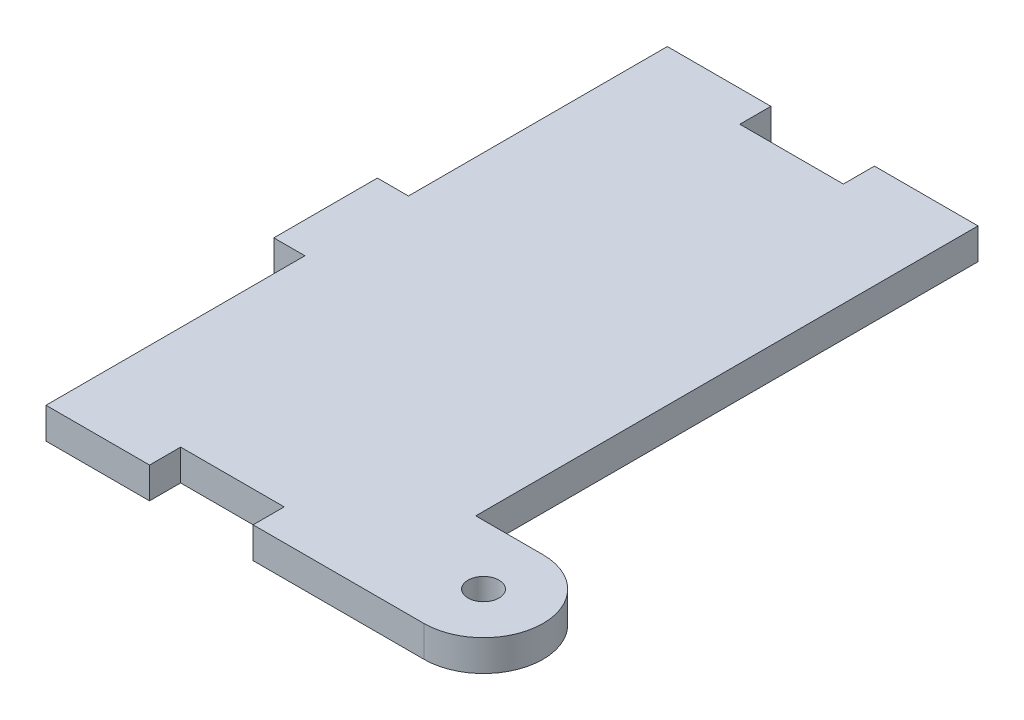
ISO-10303-21;
HEADER;
FILE_DESCRIPTION(('STEP AP214'),'2;1');
FILE_NAME('part.step','',(''),(''),'','','');
FILE_SCHEMA(('AUTOMOTIVE_DESIGN { 1 0 10303 214 1 1 1 1 }'));
ENDSEC;
DATA;
#1=APPLICATION_CONTEXT('core data for automotive mechanical design processes');
#2=APPLICATION_PROTOCOL_DEFINITION('international standard','automotive_design',2000,#1);
#3=PRODUCT_CONTEXT('',#1,'mechanical');
#4=PRODUCT('Part','Part','',(#3));
#5=PRODUCT_RELATED_PRODUCT_CATEGORY('part','',(#4));
#6=PRODUCT_DEFINITION_FORMATION('','',#4);
#7=PRODUCT_DEFINITION_CONTEXT('part definition',#1,'design');
#8=PRODUCT_DEFINITION('design','',#6,#7);
#9=PRODUCT_DEFINITION_SHAPE('','',#8);
#10=(LENGTH_UNIT() NAMED_UNIT(*) SI_UNIT(.MILLI.,.METRE.));
#11=(NAMED_UNIT(*) PLANE_ANGLE_UNIT() SI_UNIT($,.RADIAN.));
#12=(NAMED_UNIT(*) SI_UNIT($,.STERADIAN.) SOLID_ANGLE_UNIT());
#13=UNCERTAINTY_MEASURE_WITH_UNIT(LENGTH_MEASURE(1.E-05),#10,'distance_accuracy_value','');
#14=(GEOMETRIC_REPRESENTATION_CONTEXT(3) GLOBAL_UNCERTAINTY_ASSIGNED_CONTEXT((#13)) GLOBAL_UNIT_ASSIGNED_CONTEXT((#10,
#11,#12)) REPRESENTATION_CONTEXT('',''));
#15=CARTESIAN_POINT('',(0.,0.,0.));
#16=DIRECTION('',(0.,0.,1.));
#17=DIRECTION('',(1.,0.,0.));
#18=AXIS2_PLACEMENT_3D('',#15,#16,#17);
#19=CARTESIAN_POINT('',(21.5,3.,24.2499999999999));
#20=DIRECTION('',(0.,1.,0.));
#21=DIRECTION('',(0.,0.,1.));
#22=AXIS2_PLACEMENT_3D('',#19,#20,#21);
#23=PLANE('',#22);
#24=DIRECTION('',(1.,0.,0.));
#25=VECTOR('',#24,1.);
#26=CARTESIAN_POINT('',(-5.00000000000001,3.,29.9999999999999));
#27=LINE('',#26,#25);
#28=CARTESIAN_POINT('',(-15.,3.,29.9999999999999));
#29=VERTEX_POINT('',#28);
#30=CARTESIAN_POINT('',(-5.00000000000001,3.,29.9999999999999));
#31=VERTEX_POINT('',#30);
#32=EDGE_CURVE('E227',#29,#31,#27,.T.);
#33=ORIENTED_EDGE('',*,*,#32,.T.);
#34=DIRECTION('',(0.,0.,-1.));
#35=VECTOR('',#34,1.);
#36=CARTESIAN_POINT('',(-5.00000000000001,3.,29.9999999999999));
#37=LINE('',#36,#35);
#38=CARTESIAN_POINT('',(-5.00000000000001,3.,26.9999999999999));
#39=VERTEX_POINT('',#38);
#40=EDGE_CURVE('E123',#31,#39,#37,.T.);
#41=ORIENTED_EDGE('',*,*,#40,.T.);
#42=DIRECTION('',(1.,0.,0.));
#43=VECTOR('',#42,1.);
#44=CARTESIAN_POINT('',(-5.00000000000001,3.,26.9999999999999));
#45=LINE('',#44,#43);
#46=CARTESIAN_POINT('',(4.99999999999999,3.,26.9999999999999));
#47=VERTEX_POINT('',#46);
#48=EDGE_CURVE('E272',#39,#47,#45,.T.);
#49=ORIENTED_EDGE('',*,*,#48,.T.);
#50=DIRECTION('',(0.,0.,1.));
#51=VECTOR('',#50,1.);
#52=CARTESIAN_POINT('',(4.99999999999999,3.,29.9999999999999));
#53=LINE('',#52,#51);
#54=CARTESIAN_POINT('',(4.99999999999999,3.,29.9999999999999));
#55=VERTEX_POINT('',#54);
#56=EDGE_CURVE('E290',#47,#55,#53,.T.);
#57=ORIENTED_EDGE('',*,*,#56,.T.);
#58=DIRECTION('',(1.,0.,0.));
#59=VECTOR('',#58,1.);
#60=CARTESIAN_POINT('',(15.,3.,29.9999999999999));
#61=LINE('',#60,#59);
#62=CARTESIAN_POINT('',(21.5,3.,29.9999999999999));
#63=VERTEX_POINT('',#62);
#64=EDGE_CURVE('E287',#55,#63,#61,.T.);
#65=ORIENTED_EDGE('',*,*,#64,.T.);
#66=CARTESIAN_POINT('',(21.5,3.,24.2499999999999));
#67=DIRECTION('',(0.,1.,0.));
#68=DIRECTION('',(0.,0.,1.));
#69=AXIS2_PLACEMENT_3D('',#66,#67,#68);
#70=CIRCLE('',#69,5.75);
#71=CARTESIAN_POINT('',(21.5,3.,18.4999999999999));
#72=VERTEX_POINT('',#71);
#73=EDGE_CURVE('E289',#63,#72,#70,.T.);
#74=ORIENTED_EDGE('',*,*,#73,.T.);
#75=DIRECTION('',(-1.,0.,0.));
#76=VECTOR('',#75,1.);
#77=CARTESIAN_POINT('',(21.5,3.,18.4999999999999));
#78=LINE('',#77,#76);
#79=CARTESIAN_POINT('',(15.,3.,18.4999999999999));
#80=VERTEX_POINT('',#79);
#81=EDGE_CURVE('E292',#72,#80,#78,.T.);
#82=ORIENTED_EDGE('',*,*,#81,.T.);
#83=DIRECTION('',(0.,0.,-1.));
#84=VECTOR('',#83,1.);
#85=CARTESIAN_POINT('',(15.,3.,4.99999999999995));
#86=LINE('',#85,#84);
#87=CARTESIAN_POINT('',(15.,3.,-30.0000000000001));
#88=VERTEX_POINT('',#87);
#89=EDGE_CURVE('E298',#80,#88,#86,.T.);
#90=ORIENTED_EDGE('',*,*,#89,.T.);
#91=DIRECTION('',(-1.,0.,0.));
#92=VECTOR('',#91,1.);
#93=CARTESIAN_POINT('',(15.,3.,-30.0000000000001));
#94=LINE('',#93,#92);
#95=CARTESIAN_POINT('',(4.99999999999999,3.,-30.0000000000001));
#96=VERTEX_POINT('',#95);
#97=EDGE_CURVE('E300',#88,#96,#94,.T.);
#98=ORIENTED_EDGE('',*,*,#97,.T.);
#99=DIRECTION('',(0.,0.,1.));
#100=VECTOR('',#99,1.);
#101=CARTESIAN_POINT('',(4.99999999999999,3.,-30.0000000000001));
#102=LINE('',#101,#100);
#103=CARTESIAN_POINT('',(4.99999999999999,3.,-27.0000000000001));
#104=VERTEX_POINT('',#103);
#105=EDGE_CURVE('E302',#96,#104,#102,.T.);
#106=ORIENTED_EDGE('',*,*,#105,.T.);
#107=DIRECTION('',(-1.,0.,0.));
#108=VECTOR('',#107,1.);
#109=CARTESIAN_POINT('',(-5.00000000000001,3.,-27.0000000000001));
#110=LINE('',#109,#108);
#111=CARTESIAN_POINT('',(-5.00000000000001,3.,-27.0000000000001));
#112=VERTEX_POINT('',#111);
#113=EDGE_CURVE('E304',#104,#112,#110,.T.);
#114=ORIENTED_EDGE('',*,*,#113,.T.);
#115=DIRECTION('',(0.,0.,-1.));
#116=VECTOR('',#115,1.);
#117=CARTESIAN_POINT('',(-5.00000000000001,3.,-30.0000000000001));
#118=LINE('',#117,#116);
#119=CARTESIAN_POINT('',(-5.00000000000001,3.,-30.0000000000001));
#120=VERTEX_POINT('',#119);
#121=EDGE_CURVE('E306',#112,#120,#118,.T.);
#122=ORIENTED_EDGE('',*,*,#121,.T.);
#123=DIRECTION('',(-1.,0.,0.));
#124=VECTOR('',#123,1.);
#125=CARTESIAN_POINT('',(-5.00000000000001,3.,-30.0000000000001));
#126=LINE('',#125,#124);
#127=CARTESIAN_POINT('',(-15.,3.,-30.0000000000001));
#128=VERTEX_POINT('',#127);
#129=EDGE_CURVE('E308',#120,#128,#126,.T.);
#130=ORIENTED_EDGE('',*,*,#129,.T.);
#131=DIRECTION('',(0.,0.,1.));
#132=VECTOR('',#131,1.);
#133=CARTESIAN_POINT('',(-15.,3.,-30.0000000000001));
#134=LINE('',#133,#132);
#135=CARTESIAN_POINT('',(-15.,3.,-5.00000000000005));
#136=VERTEX_POINT('',#135);
#137=EDGE_CURVE('E310',#128,#136,#134,.T.);
#138=ORIENTED_EDGE('',*,*,#137,.T.);
#139=DIRECTION('',(-1.,0.,0.));
#140=VECTOR('',#139,1.);
#141=CARTESIAN_POINT('',(-15.,3.,-5.00000000000005));
#142=LINE('',#141,#140);
#143=CARTESIAN_POINT('',(-18.,3.,-5.00000000000005));
#144=VERTEX_POINT('',#143);
#145=EDGE_CURVE('E172',#136,#144,#142,.T.);
#146=ORIENTED_EDGE('',*,*,#145,.T.);
#147=DIRECTION('',(0.,0.,1.));
#148=VECTOR('',#147,1.);
#149=CARTESIAN_POINT('',(-18.,3.,-5.00000000000005));
#150=LINE('',#149,#148);
#151=CARTESIAN_POINT('',(-18.,3.,4.99999999999995));
#152=VERTEX_POINT('',#151);
#153=EDGE_CURVE('E166',#144,#152,#150,.T.);
#154=ORIENTED_EDGE('',*,*,#153,.T.);
#155=DIRECTION('',(1.,0.,0.));
#156=VECTOR('',#155,1.);
#157=CARTESIAN_POINT('',(-15.,3.,4.99999999999995));
#158=LINE('',#157,#156);
#159=CARTESIAN_POINT('',(-15.,3.,4.99999999999995));
#160=VERTEX_POINT('',#159);
#161=EDGE_CURVE('E170',#152,#160,#158,.T.);
#162=ORIENTED_EDGE('',*,*,#161,.T.);
#163=DIRECTION('',(0.,0.,1.));
#164=VECTOR('',#163,1.);
#165=CARTESIAN_POINT('',(-15.,3.,4.99999999999995));
#166=LINE('',#165,#164);
#167=EDGE_CURVE('E50',#160,#29,#166,.T.);
#168=ORIENTED_EDGE('',*,*,#167,.T.);
#169=EDGE_LOOP('',(#33,#41,#49,#57,#65,#74,#82,#90,#98,#106,#114,#122,#130,#138,#146,#154,#162,#168));
#170=FACE_BOUND('',#169,.T.);
#171=CARTESIAN_POINT('',(21.5,3.,24.2499999999999));
#172=DIRECTION('',(0.,1.,0.));
#173=DIRECTION('',(0.,0.,1.));
#174=AXIS2_PLACEMENT_3D('',#171,#172,#173);
#175=CIRCLE('',#174,1.5);
#176=CARTESIAN_POINT('',(21.5,3.,25.7499999999999));
#177=VERTEX_POINT('',#176);
#178=EDGE_CURVE('E194',#177,#177,#175,.T.);
#179=ORIENTED_EDGE('',*,*,#178,.F.);
#180=EDGE_LOOP('',(#179));
#181=FACE_BOUND('',#180,.T.);
#182=ADVANCED_FACE('F33',(#170,#181),#23,.T.);
#183=CARTESIAN_POINT('',(21.5,0.,24.2499999999999));
#184=DIRECTION('',(0.,1.,0.));
#185=DIRECTION('',(0.,0.,1.));
#186=AXIS2_PLACEMENT_3D('',#183,#184,#185);
#187=PLANE('',#186);
#188=DIRECTION('',(1.,0.,0.));
#189=VECTOR('',#188,1.);
#190=CARTESIAN_POINT('',(-5.00000000000001,0.,29.9999999999999));
#191=LINE('',#190,#189);
#192=CARTESIAN_POINT('',(-15.,0.,29.9999999999999));
#193=VERTEX_POINT('',#192);
#194=CARTESIAN_POINT('',(-5.00000000000001,0.,29.9999999999999));
#195=VERTEX_POINT('',#194);
#196=EDGE_CURVE('E190',#193,#195,#191,.T.);
#197=ORIENTED_EDGE('',*,*,#196,.F.);
#198=DIRECTION('',(0.,0.,1.));
#199=VECTOR('',#198,1.);
#200=CARTESIAN_POINT('',(-15.,0.,4.99999999999995));
#201=LINE('',#200,#199);
#202=CARTESIAN_POINT('',(-15.,0.,4.99999999999995));
#203=VERTEX_POINT('',#202);
#204=EDGE_CURVE('E115',#203,#193,#201,.T.);
#205=ORIENTED_EDGE('',*,*,#204,.F.);
#206=DIRECTION('',(1.,0.,0.));
#207=VECTOR('',#206,1.);
#208=CARTESIAN_POINT('',(-15.,0.,4.99999999999995));
#209=LINE('',#208,#207);
#210=CARTESIAN_POINT('',(-18.,0.,4.99999999999995));
#211=VERTEX_POINT('',#210);
#212=EDGE_CURVE('E109',#211,#203,#209,.T.);
#213=ORIENTED_EDGE('',*,*,#212,.F.);
#214=DIRECTION('',(0.,0.,1.));
#215=VECTOR('',#214,1.);
#216=CARTESIAN_POINT('',(-18.,0.,-5.00000000000005));
#217=LINE('',#216,#215);
#218=CARTESIAN_POINT('',(-18.,0.,-5.00000000000005));
#219=VERTEX_POINT('',#218);
#220=EDGE_CURVE('E180',#219,#211,#217,.T.);
#221=ORIENTED_EDGE('',*,*,#220,.F.);
#222=DIRECTION('',(-1.,0.,0.));
#223=VECTOR('',#222,1.);
#224=CARTESIAN_POINT('',(-15.,0.,-5.00000000000005));
#225=LINE('',#224,#223);
#226=CARTESIAN_POINT('',(-15.,0.,-5.00000000000005));
#227=VERTEX_POINT('',#226);
#228=EDGE_CURVE('E222',#227,#219,#225,.T.);
#229=ORIENTED_EDGE('',*,*,#228,.F.);
#230=DIRECTION('',(0.,0.,1.));
#231=VECTOR('',#230,1.);
#232=CARTESIAN_POINT('',(-15.,0.,-30.0000000000001));
#233=LINE('',#232,#231);
#234=CARTESIAN_POINT('',(-15.,0.,-30.0000000000001));
#235=VERTEX_POINT('',#234);
#236=EDGE_CURVE('E220',#235,#227,#233,.T.);
#237=ORIENTED_EDGE('',*,*,#236,.F.);
#238=DIRECTION('',(-1.,0.,0.));
#239=VECTOR('',#238,1.);
#240=CARTESIAN_POINT('',(-5.00000000000001,0.,-30.0000000000001));
#241=LINE('',#240,#239);
#242=CARTESIAN_POINT('',(-5.00000000000001,0.,-30.0000000000001));
#243=VERTEX_POINT('',#242);
#244=EDGE_CURVE('E218',#243,#235,#241,.T.);
#245=ORIENTED_EDGE('',*,*,#244,.F.);
#246=DIRECTION('',(0.,0.,-1.));
#247=VECTOR('',#246,1.);
#248=CARTESIAN_POINT('',(-5.00000000000001,0.,-30.0000000000001));
#249=LINE('',#248,#247);
#250=CARTESIAN_POINT('',(-5.00000000000001,0.,-27.0000000000001));
#251=VERTEX_POINT('',#250);
#252=EDGE_CURVE('E216',#251,#243,#249,.T.);
#253=ORIENTED_EDGE('',*,*,#252,.F.);
#254=DIRECTION('',(-1.,0.,0.));
#255=VECTOR('',#254,1.);
#256=CARTESIAN_POINT('',(-5.00000000000001,0.,-27.0000000000001));
#257=LINE('',#256,#255);
#258=CARTESIAN_POINT('',(4.99999999999999,0.,-27.0000000000001));
#259=VERTEX_POINT('',#258);
#260=EDGE_CURVE('E214',#259,#251,#257,.T.);
#261=ORIENTED_EDGE('',*,*,#260,.F.);
#262=DIRECTION('',(0.,0.,1.));
#263=VECTOR('',#262,1.);
#264=CARTESIAN_POINT('',(4.99999999999999,0.,-30.0000000000001));
#265=LINE('',#264,#263);
#266=CARTESIAN_POINT('',(4.99999999999999,0.,-30.0000000000001));
#267=VERTEX_POINT('',#266);
#268=EDGE_CURVE('E212',#267,#259,#265,.T.);
#269=ORIENTED_EDGE('',*,*,#268,.F.);
#270=DIRECTION('',(-1.,0.,0.));
#271=VECTOR('',#270,1.);
#272=CARTESIAN_POINT('',(15.,0.,-30.0000000000001));
#273=LINE('',#272,#271);
#274=CARTESIAN_POINT('',(15.,0.,-30.0000000000001));
#275=VERTEX_POINT('',#274);
#276=EDGE_CURVE('E210',#275,#267,#273,.T.);
#277=ORIENTED_EDGE('',*,*,#276,.F.);
#278=DIRECTION('',(0.,0.,-1.));
#279=VECTOR('',#278,1.);
#280=CARTESIAN_POINT('',(15.,0.,-30.0000000000001));
#281=LINE('',#280,#279);
#282=CARTESIAN_POINT('',(15.,0.,18.4999999999999));
#283=VERTEX_POINT('',#282);
#284=EDGE_CURVE('E208',#283,#275,#281,.T.);
#285=ORIENTED_EDGE('',*,*,#284,.F.);
#286=DIRECTION('',(-1.,0.,0.));
#287=VECTOR('',#286,1.);
#288=CARTESIAN_POINT('',(21.5,0.,18.4999999999999));
#289=LINE('',#288,#287);
#290=CARTESIAN_POINT('',(21.5,0.,18.4999999999999));
#291=VERTEX_POINT('',#290);
#292=EDGE_CURVE('E205',#291,#283,#289,.T.);
#293=ORIENTED_EDGE('',*,*,#292,.F.);
#294=CARTESIAN_POINT('',(21.5,0.,24.2499999999999));
#295=DIRECTION('',(0.,1.,0.));
#296=DIRECTION('',(0.,0.,1.));
#297=AXIS2_PLACEMENT_3D('',#294,#295,#296);
#298=CIRCLE('',#297,5.75);
#299=CARTESIAN_POINT('',(21.5,0.,29.9999999999999));
#300=VERTEX_POINT('',#299);
#301=EDGE_CURVE('E203',#300,#291,#298,.T.);
#302=ORIENTED_EDGE('',*,*,#301,.F.);
#303=DIRECTION('',(1.,0.,0.));
#304=VECTOR('',#303,1.);
#305=CARTESIAN_POINT('',(21.5,0.,29.9999999999999));
#306=LINE('',#305,#304);
#307=CARTESIAN_POINT('',(4.99999999999999,0.,29.9999999999999));
#308=VERTEX_POINT('',#307);
#309=EDGE_CURVE('E201',#308,#300,#306,.T.);
#310=ORIENTED_EDGE('',*,*,#309,.F.);
#311=DIRECTION('',(0.,0.,1.));
#312=VECTOR('',#311,1.);
#313=CARTESIAN_POINT('',(4.99999999999999,0.,29.9999999999999));
#314=LINE('',#313,#312);
#315=CARTESIAN_POINT('',(4.99999999999999,0.,26.9999999999999));
#316=VERTEX_POINT('',#315);
#317=EDGE_CURVE('E198',#316,#308,#314,.T.);
#318=ORIENTED_EDGE('',*,*,#317,.F.);
#319=DIRECTION('',(1.,0.,0.));
#320=VECTOR('',#319,1.);
#321=CARTESIAN_POINT('',(-5.00000000000001,0.,26.9999999999999));
#322=LINE('',#321,#320);
#323=CARTESIAN_POINT('',(-5.00000000000001,0.,26.9999999999999));
#324=VERTEX_POINT('',#323);
#325=EDGE_CURVE('E196',#324,#316,#322,.T.);
#326=ORIENTED_EDGE('',*,*,#325,.F.);
#327=DIRECTION('',(0.,0.,-1.));
#328=VECTOR('',#327,1.);
#329=CARTESIAN_POINT('',(-5.00000000000001,0.,29.9999999999999));
#330=LINE('',#329,#328);
#331=EDGE_CURVE('E193',#195,#324,#330,.T.);
#332=ORIENTED_EDGE('',*,*,#331,.F.);
#333=EDGE_LOOP('',(#197,#205,#213,#221,#229,#237,#245,#253,#261,#269,#277,#285,#293,#302,#310,
#318,#326,#332));
#334=FACE_BOUND('',#333,.T.);
#335=CARTESIAN_POINT('',(21.5,0.,24.2499999999999));
#336=DIRECTION('',(0.,1.,0.));
#337=DIRECTION('',(0.,0.,1.));
#338=AXIS2_PLACEMENT_3D('',#335,#336,#337);
#339=CIRCLE('',#338,1.5);
#340=CARTESIAN_POINT('',(21.5,0.,25.7499999999999));
#341=VERTEX_POINT('',#340);
#342=EDGE_CURVE('E540',#341,#341,#339,.T.);
#343=ORIENTED_EDGE('',*,*,#342,.T.);
#344=EDGE_LOOP('',(#343));
#345=FACE_BOUND('',#344,.T.);
#346=ADVANCED_FACE('F276',(#334,#345),#187,.F.);
#347=CARTESIAN_POINT('',(-5.00000000000001,3.,29.9999999999999));
#348=DIRECTION('',(0.,0.,-1.));
#349=DIRECTION('',(-1.,0.,0.));
#350=AXIS2_PLACEMENT_3D('',#347,#348,#349);
#351=PLANE('',#350);
#352=ORIENTED_EDGE('',*,*,#196,.T.);
#353=DIRECTION('',(0.,-1.,0.));
#354=VECTOR('',#353,1.);
#355=CARTESIAN_POINT('',(-5.00000000000001,3.,29.9999999999999));
#356=LINE('',#355,#354);
#357=EDGE_CURVE('E11',#31,#195,#356,.T.);
#358=ORIENTED_EDGE('',*,*,#357,.F.);
#359=ORIENTED_EDGE('',*,*,#32,.F.);
#360=DIRECTION('',(0.,-1.,0.));
#361=VECTOR('',#360,1.);
#362=CARTESIAN_POINT('',(-15.,3.,29.9999999999999));
#363=LINE('',#362,#361);
#364=EDGE_CURVE('E186',#29,#193,#363,.T.);
#365=ORIENTED_EDGE('',*,*,#364,.T.);
#366=EDGE_LOOP('',(#352,#358,#359,#365));
#367=FACE_BOUND('',#366,.T.);
#368=ADVANCED_FACE('F35',(#367),#351,.F.);
#369=CARTESIAN_POINT('',(-5.00000000000001,3.,29.9999999999999));
#370=DIRECTION('',(-1.,0.,0.));
#371=DIRECTION('',(0.,0.,1.));
#372=AXIS2_PLACEMENT_3D('',#369,#370,#371);
#373=PLANE('',#372);
#374=ORIENTED_EDGE('',*,*,#331,.T.);
#375=DIRECTION('',(0.,-1.,0.));
#376=VECTOR('',#375,1.);
#377=CARTESIAN_POINT('',(-5.00000000000001,3.,26.9999999999999));
#378=LINE('',#377,#376);
#379=EDGE_CURVE('E42',#39,#324,#378,.T.);
#380=ORIENTED_EDGE('',*,*,#379,.F.);
#381=ORIENTED_EDGE('',*,*,#40,.F.);
#382=ORIENTED_EDGE('',*,*,#357,.T.);
#383=EDGE_LOOP('',(#374,#380,#381,#382));
#384=FACE_BOUND('',#383,.T.);
#385=ADVANCED_FACE('F344',(#384),#373,.F.);
#386=CARTESIAN_POINT('',(-5.00000000000001,3.,26.9999999999999));
#387=DIRECTION('',(0.,0.,-1.));
#388=DIRECTION('',(-1.,0.,0.));
#389=AXIS2_PLACEMENT_3D('',#386,#387,#388);
#390=PLANE('',#389);
#391=ORIENTED_EDGE('',*,*,#325,.T.);
#392=DIRECTION('',(0.,-1.,0.));
#393=VECTOR('',#392,1.);
#394=CARTESIAN_POINT('',(4.99999999999999,3.,26.9999999999999));
#395=LINE('',#394,#393);
#396=EDGE_CURVE('E264',#47,#316,#395,.T.);
#397=ORIENTED_EDGE('',*,*,#396,.F.);
#398=ORIENTED_EDGE('',*,*,#48,.F.);
#399=ORIENTED_EDGE('',*,*,#379,.T.);
#400=EDGE_LOOP('',(#391,#397,#398,#399));
#401=FACE_BOUND('',#400,.T.);
#402=ADVANCED_FACE('F270',(#401),#390,.F.);
#403=CARTESIAN_POINT('',(4.99999999999999,3.,29.9999999999999));
#404=DIRECTION('',(1.,0.,0.));
#405=DIRECTION('',(0.,0.,-1.));
#406=AXIS2_PLACEMENT_3D('',#403,#404,#405);
#407=PLANE('',#406);
#408=ORIENTED_EDGE('',*,*,#317,.T.);
#409=DIRECTION('',(0.,-1.,0.));
#410=VECTOR('',#409,1.);
#411=CARTESIAN_POINT('',(4.99999999999999,3.,29.9999999999999));
#412=LINE('',#411,#410);
#413=EDGE_CURVE('E261',#55,#308,#412,.T.);
#414=ORIENTED_EDGE('',*,*,#413,.F.);
#415=ORIENTED_EDGE('',*,*,#56,.F.);
#416=ORIENTED_EDGE('',*,*,#396,.T.);
#417=EDGE_LOOP('',(#408,#414,#415,#416));
#418=FACE_BOUND('',#417,.T.);
#419=ADVANCED_FACE('F281',(#418),#407,.F.);
#420=CARTESIAN_POINT('',(21.5,3.,29.9999999999999));
#421=DIRECTION('',(0.,0.,-1.));
#422=DIRECTION('',(-1.,0.,0.));
#423=AXIS2_PLACEMENT_3D('',#420,#421,#422);
#424=PLANE('',#423);
#425=ORIENTED_EDGE('',*,*,#309,.T.);
#426=DIRECTION('',(0.,-1.,0.));
#427=VECTOR('',#426,1.);
#428=CARTESIAN_POINT('',(21.5,3.,29.9999999999999));
#429=LINE('',#428,#427);
#430=EDGE_CURVE('E258',#63,#300,#429,.T.);
#431=ORIENTED_EDGE('',*,*,#430,.F.);
#432=ORIENTED_EDGE('',*,*,#64,.F.);
#433=ORIENTED_EDGE('',*,*,#413,.T.);
#434=EDGE_LOOP('',(#425,#431,#432,#433));
#435=FACE_BOUND('',#434,.T.);
#436=ADVANCED_FACE('F285',(#435),#424,.F.);
#437=CARTESIAN_POINT('',(21.5,3.,24.2499999999999));
#438=DIRECTION('',(0.,-1.,0.));
#439=DIRECTION('',(0.,0.,-1.));
#440=AXIS2_PLACEMENT_3D('',#437,#438,#439);
#441=CYLINDRICAL_SURFACE('',#440,5.75);
#442=ORIENTED_EDGE('',*,*,#301,.T.);
#443=DIRECTION('',(0.,-1.,0.));
#444=VECTOR('',#443,1.);
#445=CARTESIAN_POINT('',(21.5,3.,18.4999999999999));
#446=LINE('',#445,#444);
#447=EDGE_CURVE('E255',#72,#291,#446,.T.);
#448=ORIENTED_EDGE('',*,*,#447,.F.);
#449=ORIENTED_EDGE('',*,*,#73,.F.);
#450=ORIENTED_EDGE('',*,*,#430,.T.);
#451=EDGE_LOOP('',(#442,#448,#449,#450));
#452=FACE_BOUND('',#451,.T.);
#453=ADVANCED_FACE('F357',(#452),#441,.T.);
#454=CARTESIAN_POINT('',(21.5,3.,18.4999999999999));
#455=DIRECTION('',(0.,0.,1.));
#456=DIRECTION('',(1.,0.,0.));
#457=AXIS2_PLACEMENT_3D('',#454,#455,#456);
#458=PLANE('',#457);
#459=ORIENTED_EDGE('',*,*,#292,.T.);
#460=DIRECTION('',(0.,-1.,0.));
#461=VECTOR('',#460,1.);
#462=CARTESIAN_POINT('',(15.,3.,18.4999999999999));
#463=LINE('',#462,#461);
#464=EDGE_CURVE('E252',#80,#283,#463,.T.);
#465=ORIENTED_EDGE('',*,*,#464,.F.);
#466=ORIENTED_EDGE('',*,*,#81,.F.);
#467=ORIENTED_EDGE('',*,*,#447,.T.);
#468=EDGE_LOOP('',(#459,#465,#466,#467));
#469=FACE_BOUND('',#468,.T.);
#470=ADVANCED_FACE('F360',(#469),#458,.F.);
#471=CARTESIAN_POINT('',(15.,3.,-30.0000000000001));
#472=DIRECTION('',(-1.,0.,0.));
#473=DIRECTION('',(0.,0.,1.));
#474=AXIS2_PLACEMENT_3D('',#471,#472,#473);
#475=PLANE('',#474);
#476=ORIENTED_EDGE('',*,*,#284,.T.);
#477=DIRECTION('',(0.,-1.,0.));
#478=VECTOR('',#477,1.);
#479=CARTESIAN_POINT('',(15.,3.,-30.0000000000001));
#480=LINE('',#479,#478);
#481=EDGE_CURVE('E249',#88,#275,#480,.T.);
#482=ORIENTED_EDGE('',*,*,#481,.F.);
#483=ORIENTED_EDGE('',*,*,#89,.F.);
#484=ORIENTED_EDGE('',*,*,#464,.T.);
#485=EDGE_LOOP('',(#476,#482,#483,#484));
#486=FACE_BOUND('',#485,.T.);
#487=ADVANCED_FACE('F364',(#486),#475,.F.);
#488=CARTESIAN_POINT('',(15.,3.,-30.0000000000001));
#489=DIRECTION('',(0.,0.,1.));
#490=DIRECTION('',(1.,0.,0.));
#491=AXIS2_PLACEMENT_3D('',#488,#489,#490);
#492=PLANE('',#491);
#493=ORIENTED_EDGE('',*,*,#276,.T.);
#494=DIRECTION('',(0.,-1.,0.));
#495=VECTOR('',#494,1.);
#496=CARTESIAN_POINT('',(4.99999999999999,3.,-30.0000000000001));
#497=LINE('',#496,#495);
#498=EDGE_CURVE('E246',#96,#267,#497,.T.);
#499=ORIENTED_EDGE('',*,*,#498,.F.);
#500=ORIENTED_EDGE('',*,*,#97,.F.);
#501=ORIENTED_EDGE('',*,*,#481,.T.);
#502=EDGE_LOOP('',(#493,#499,#500,#501));
#503=FACE_BOUND('',#502,.T.);
#504=ADVANCED_FACE('F368',(#503),#492,.F.);
#505=CARTESIAN_POINT('',(4.99999999999999,3.,-30.0000000000001));
#506=DIRECTION('',(1.,0.,0.));
#507=DIRECTION('',(0.,0.,-1.));
#508=AXIS2_PLACEMENT_3D('',#505,#506,#507);
#509=PLANE('',#508);
#510=ORIENTED_EDGE('',*,*,#268,.T.);
#511=DIRECTION('',(0.,-1.,0.));
#512=VECTOR('',#511,1.);
#513=CARTESIAN_POINT('',(4.99999999999999,3.,-27.0000000000001));
#514=LINE('',#513,#512);
#515=EDGE_CURVE('E243',#104,#259,#514,.T.);
#516=ORIENTED_EDGE('',*,*,#515,.F.);
#517=ORIENTED_EDGE('',*,*,#105,.F.);
#518=ORIENTED_EDGE('',*,*,#498,.T.);
#519=EDGE_LOOP('',(#510,#516,#517,#518));
#520=FACE_BOUND('',#519,.T.);
#521=ADVANCED_FACE('F372',(#520),#509,.F.);
#522=CARTESIAN_POINT('',(-5.00000000000001,3.,-27.0000000000001));
#523=DIRECTION('',(0.,0.,1.));
#524=DIRECTION('',(1.,0.,0.));
#525=AXIS2_PLACEMENT_3D('',#522,#523,#524);
#526=PLANE('',#525);
#527=ORIENTED_EDGE('',*,*,#260,.T.);
#528=DIRECTION('',(0.,-1.,0.));
#529=VECTOR('',#528,1.);
#530=CARTESIAN_POINT('',(-5.00000000000001,3.,-27.0000000000001));
#531=LINE('',#530,#529);
#532=EDGE_CURVE('E240',#112,#251,#531,.T.);
#533=ORIENTED_EDGE('',*,*,#532,.F.);
#534=ORIENTED_EDGE('',*,*,#113,.F.);
#535=ORIENTED_EDGE('',*,*,#515,.T.);
#536=EDGE_LOOP('',(#527,#533,#534,#535));
#537=FACE_BOUND('',#536,.T.);
#538=ADVANCED_FACE('F376',(#537),#526,.F.);
#539=CARTESIAN_POINT('',(-5.00000000000001,3.,-30.0000000000001));
#540=DIRECTION('',(-1.,0.,0.));
#541=DIRECTION('',(0.,0.,1.));
#542=AXIS2_PLACEMENT_3D('',#539,#540,#541);
#543=PLANE('',#542);
#544=ORIENTED_EDGE('',*,*,#252,.T.);
#545=DIRECTION('',(0.,-1.,0.));
#546=VECTOR('',#545,1.);
#547=CARTESIAN_POINT('',(-5.00000000000001,3.,-30.0000000000001));
#548=LINE('',#547,#546);
#549=EDGE_CURVE('E237',#120,#243,#548,.T.);
#550=ORIENTED_EDGE('',*,*,#549,.F.);
#551=ORIENTED_EDGE('',*,*,#121,.F.);
#552=ORIENTED_EDGE('',*,*,#532,.T.);
#553=EDGE_LOOP('',(#544,#550,#551,#552));
#554=FACE_BOUND('',#553,.T.);
#555=ADVANCED_FACE('F380',(#554),#543,.F.);
#556=CARTESIAN_POINT('',(-5.00000000000001,3.,-30.0000000000001));
#557=DIRECTION('',(0.,0.,1.));
#558=DIRECTION('',(1.,0.,0.));
#559=AXIS2_PLACEMENT_3D('',#556,#557,#558);
#560=PLANE('',#559);
#561=ORIENTED_EDGE('',*,*,#244,.T.);
#562=DIRECTION('',(0.,-1.,0.));
#563=VECTOR('',#562,1.);
#564=CARTESIAN_POINT('',(-15.,3.,-30.0000000000001));
#565=LINE('',#564,#563);
#566=EDGE_CURVE('E234',#128,#235,#565,.T.);
#567=ORIENTED_EDGE('',*,*,#566,.F.);
#568=ORIENTED_EDGE('',*,*,#129,.F.);
#569=ORIENTED_EDGE('',*,*,#549,.T.);
#570=EDGE_LOOP('',(#561,#567,#568,#569));
#571=FACE_BOUND('',#570,.T.);
#572=ADVANCED_FACE('F384',(#571),#560,.F.);
#573=CARTESIAN_POINT('',(-15.,3.,-30.0000000000001));
#574=DIRECTION('',(1.,0.,0.));
#575=DIRECTION('',(0.,0.,-1.));
#576=AXIS2_PLACEMENT_3D('',#573,#574,#575);
#577=PLANE('',#576);
#578=ORIENTED_EDGE('',*,*,#236,.T.);
#579=DIRECTION('',(0.,-1.,0.));
#580=VECTOR('',#579,1.);
#581=CARTESIAN_POINT('',(-15.,3.,-5.00000000000005));
#582=LINE('',#581,#580);
#583=EDGE_CURVE('E231',#136,#227,#582,.T.);
#584=ORIENTED_EDGE('',*,*,#583,.F.);
#585=ORIENTED_EDGE('',*,*,#137,.F.);
#586=ORIENTED_EDGE('',*,*,#566,.T.);
#587=EDGE_LOOP('',(#578,#584,#585,#586));
#588=FACE_BOUND('',#587,.T.);
#589=ADVANCED_FACE('F316',(#588),#577,.F.);
#590=CARTESIAN_POINT('',(-15.,3.,-5.00000000000005));
#591=DIRECTION('',(0.,0.,1.));
#592=DIRECTION('',(1.,0.,0.));
#593=AXIS2_PLACEMENT_3D('',#590,#591,#592);
#594=PLANE('',#593);
#595=ORIENTED_EDGE('',*,*,#228,.T.);
#596=DIRECTION('',(0.,-1.,0.));
#597=VECTOR('',#596,1.);
#598=CARTESIAN_POINT('',(-18.,3.,-5.00000000000005));
#599=LINE('',#598,#597);
#600=EDGE_CURVE('E181',#144,#219,#599,.T.);
#601=ORIENTED_EDGE('',*,*,#600,.F.);
#602=ORIENTED_EDGE('',*,*,#145,.F.);
#603=ORIENTED_EDGE('',*,*,#583,.T.);
#604=EDGE_LOOP('',(#595,#601,#602,#603));
#605=FACE_BOUND('',#604,.T.);
#606=ADVANCED_FACE('F320',(#605),#594,.F.);
#607=CARTESIAN_POINT('',(-18.,3.,-5.00000000000005));
#608=DIRECTION('',(1.,0.,0.));
#609=DIRECTION('',(0.,0.,-1.));
#610=AXIS2_PLACEMENT_3D('',#607,#608,#609);
#611=PLANE('',#610);
#612=ORIENTED_EDGE('',*,*,#220,.T.);
#613=DIRECTION('',(0.,-1.,0.));
#614=VECTOR('',#613,1.);
#615=CARTESIAN_POINT('',(-18.,3.,4.99999999999995));
#616=LINE('',#615,#614);
#617=EDGE_CURVE('E177',#152,#211,#616,.T.);
#618=ORIENTED_EDGE('',*,*,#617,.F.);
#619=ORIENTED_EDGE('',*,*,#153,.F.);
#620=ORIENTED_EDGE('',*,*,#600,.T.);
#621=EDGE_LOOP('',(#612,#618,#619,#620));
#622=FACE_BOUND('',#621,.T.);
#623=ADVANCED_FACE('F178',(#622),#611,.F.);
#624=CARTESIAN_POINT('',(-15.,3.,4.99999999999995));
#625=DIRECTION('',(0.,0.,-1.));
#626=DIRECTION('',(-1.,0.,0.));
#627=AXIS2_PLACEMENT_3D('',#624,#625,#626);
#628=PLANE('',#627);
#629=ORIENTED_EDGE('',*,*,#212,.T.);
#630=DIRECTION('',(0.,-1.,0.));
#631=VECTOR('',#630,1.);
#632=CARTESIAN_POINT('',(-15.,3.,4.99999999999995));
#633=LINE('',#632,#631);
#634=EDGE_CURVE('E182',#160,#203,#633,.T.);
#635=ORIENTED_EDGE('',*,*,#634,.F.);
#636=ORIENTED_EDGE('',*,*,#161,.F.);
#637=ORIENTED_EDGE('',*,*,#617,.T.);
#638=EDGE_LOOP('',(#629,#635,#636,#637));
#639=FACE_BOUND('',#638,.T.);
#640=ADVANCED_FACE('F184',(#639),#628,.F.);
#641=CARTESIAN_POINT('',(-15.,3.,4.99999999999995));
#642=DIRECTION('',(1.,0.,0.));
#643=DIRECTION('',(0.,0.,-1.));
#644=AXIS2_PLACEMENT_3D('',#641,#642,#643);
#645=PLANE('',#644);
#646=ORIENTED_EDGE('',*,*,#204,.T.);
#647=ORIENTED_EDGE('',*,*,#364,.F.);
#648=ORIENTED_EDGE('',*,*,#167,.F.);
#649=ORIENTED_EDGE('',*,*,#634,.T.);
#650=EDGE_LOOP('',(#646,#647,#648,#649));
#651=FACE_BOUND('',#650,.T.);
#652=ADVANCED_FACE('F324',(#651),#645,.F.);
#653=CARTESIAN_POINT('',(21.5,3.,24.2499999999999));
#654=DIRECTION('',(0.,-1.,0.));
#655=DIRECTION('',(0.,0.,-1.));
#656=AXIS2_PLACEMENT_3D('',#653,#654,#655);
#657=CYLINDRICAL_SURFACE('',#656,1.5);
#658=ORIENTED_EDGE('',*,*,#178,.T.);
#659=EDGE_LOOP('',(#658));
#660=FACE_BOUND('',#659,.T.);
#661=ORIENTED_EDGE('',*,*,#342,.F.);
#662=EDGE_LOOP('',(#661));
#663=FACE_BOUND('',#662,.T.);
#664=ADVANCED_FACE('F326',(#660,#663),#657,.F.);
#665=CLOSED_SHELL('',(#182,#346,#368,#385,#402,#419,#436,#453,#470,#487,#504,#521,#538,#555,
#572,#589,#606,#623,#640,#652,#664));
#666=MANIFOLD_SOLID_BREP('B2',#665);
#667=ADVANCED_BREP_SHAPE_REPRESENTATION('',(#18,#666),#14);
#668=SHAPE_DEFINITION_REPRESENTATION(#9,#667);
ENDSEC;
END-ISO-10303-21;
